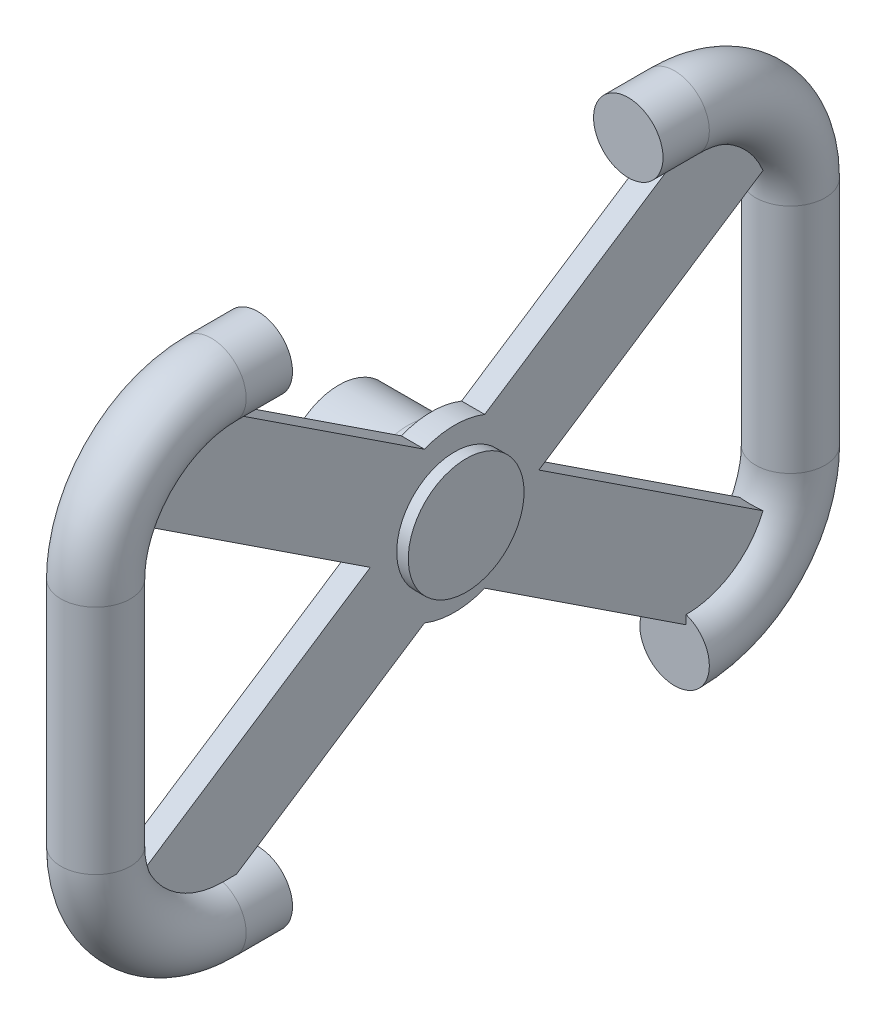
ISO-10303-21;
HEADER;
FILE_DESCRIPTION(('STEP AP214'),'2;1');
FILE_NAME('part.step','',(''),(''),'','','');
FILE_SCHEMA(('AUTOMOTIVE_DESIGN { 1 0 10303 214 1 1 1 1 }'));
ENDSEC;
DATA;
#1=APPLICATION_CONTEXT('core data for automotive mechanical design processes');
#2=APPLICATION_PROTOCOL_DEFINITION('international standard','automotive_design',2000,#1);
#3=PRODUCT_CONTEXT('',#1,'mechanical');
#4=PRODUCT('Part','Part','',(#3));
#5=PRODUCT_RELATED_PRODUCT_CATEGORY('part','',(#4));
#6=PRODUCT_DEFINITION_FORMATION('','',#4);
#7=PRODUCT_DEFINITION_CONTEXT('part definition',#1,'design');
#8=PRODUCT_DEFINITION('design','',#6,#7);
#9=PRODUCT_DEFINITION_SHAPE('','',#8);
#10=(LENGTH_UNIT() NAMED_UNIT(*) SI_UNIT(.MILLI.,.METRE.));
#11=(NAMED_UNIT(*) PLANE_ANGLE_UNIT() SI_UNIT($,.RADIAN.));
#12=(NAMED_UNIT(*) SI_UNIT($,.STERADIAN.) SOLID_ANGLE_UNIT());
#13=UNCERTAINTY_MEASURE_WITH_UNIT(LENGTH_MEASURE(1.E-05),#10,'distance_accuracy_value','');
#14=(GEOMETRIC_REPRESENTATION_CONTEXT(3) GLOBAL_UNCERTAINTY_ASSIGNED_CONTEXT((#13)) GLOBAL_UNIT_ASSIGNED_CONTEXT((#10,
#11,#12)) REPRESENTATION_CONTEXT('',''));
#15=CARTESIAN_POINT('',(0.,0.,0.));
#16=DIRECTION('',(0.,0.,1.));
#17=DIRECTION('',(1.,0.,0.));
#18=AXIS2_PLACEMENT_3D('',#15,#16,#17);
#19=CARTESIAN_POINT('',(-0.5,10.,0.));
#20=DIRECTION('',(1.,0.,0.));
#21=DIRECTION('',(0.,0.,-1.));
#22=AXIS2_PLACEMENT_3D('',#19,#20,#21);
#23=PLANE('',#22);
#24=DIRECTION('',(0.,0.549354169122413,0.835589610315867));
#25=VECTOR('',#24,1.);
#26=CARTESIAN_POINT('',(-0.5,19.892717906998,11.4065800408569));
#27=LINE('',#26,#25);
#28=CARTESIAN_POINT('',(-0.5,13.249078940462,1.30134009338308));
#29=VERTEX_POINT('',#28);
#30=CARTESIAN_POINT('',(-0.5,18.5857864376269,9.41868512973632));
#31=VERTEX_POINT('',#30);
#32=EDGE_CURVE('E302',#29,#31,#27,.T.);
#33=ORIENTED_EDGE('',*,*,#32,.F.);
#34=CARTESIAN_POINT('',(-0.5,10.,0.));
#35=DIRECTION('',(1.,0.,0.));
#36=DIRECTION('',(0.,0.,-1.));
#37=AXIS2_PLACEMENT_3D('',#34,#35,#36);
#38=CIRCLE('',#37,3.5);
#39=CARTESIAN_POINT('',(-0.5,6.75092105953799,1.30134009338307));
#40=VERTEX_POINT('',#39);
#41=EDGE_CURVE('E11',#29,#40,#38,.T.);
#42=ORIENTED_EDGE('',*,*,#41,.T.);
#43=DIRECTION('',(0.,0.549354169122413,-0.835589610315868));
#44=VECTOR('',#43,1.);
#45=CARTESIAN_POINT('',(-0.5,0.107282093002033,11.4065800408569));
#46=LINE('',#45,#44);
#47=CARTESIAN_POINT('',(-0.5,1.41421356237309,9.41868512973633));
#48=VERTEX_POINT('',#47);
#49=EDGE_CURVE('E324',#48,#40,#46,.T.);
#50=ORIENTED_EDGE('',*,*,#49,.F.);
#51=DIRECTION('',(0.,0.,-1.));
#52=VECTOR('',#51,1.);
#53=CARTESIAN_POINT('',(-0.5,1.41421356237309,10.));
#54=LINE('',#53,#52);
#55=CARTESIAN_POINT('',(-0.5,1.41421356237309,10.));
#56=VERTEX_POINT('',#55);
#57=EDGE_CURVE('E192',#56,#48,#54,.T.);
#58=ORIENTED_EDGE('',*,*,#57,.F.);
#59=CARTESIAN_POINT('',(-0.5,5.,10.));
#60=DIRECTION('',(-1.,0.,0.));
#61=DIRECTION('',(0.,0.,1.));
#62=AXIS2_PLACEMENT_3D('',#59,#60,#61);
#63=CIRCLE('',#62,3.58578643762691);
#64=CARTESIAN_POINT('',(-0.5,3.63823012137921,13.3171444306738));
#65=VERTEX_POINT('',#64);
#66=EDGE_CURVE('E191',#65,#56,#63,.F.);
#67=ORIENTED_EDGE('',*,*,#66,.F.);
#68=DIRECTION('',(0.,-0.549354169122413,0.835589610315867));
#69=VECTOR('',#68,1.);
#70=CARTESIAN_POINT('',(-0.5,3.4496405342655,13.6039967173465));
#71=LINE('',#70,#69);
#72=CARTESIAN_POINT('',(-0.5,10.,3.64063861241825));
#73=VERTEX_POINT('',#72);
#74=EDGE_CURVE('E314',#73,#65,#71,.T.);
#75=ORIENTED_EDGE('',*,*,#74,.F.);
#76=DIRECTION('',(0.,-0.549354169122414,-0.835589610315867));
#77=VECTOR('',#76,1.);
#78=CARTESIAN_POINT('',(-0.5,16.5503594657345,13.6039967173465));
#79=LINE('',#78,#77);
#80=CARTESIAN_POINT('',(-0.5,16.361769878618,13.3171444306695));
#81=VERTEX_POINT('',#80);
#82=EDGE_CURVE('E309',#81,#73,#79,.T.);
#83=ORIENTED_EDGE('',*,*,#82,.F.);
#84=CARTESIAN_POINT('',(-0.5,15.,10.));
#85=DIRECTION('',(-1.,0.,0.));
#86=DIRECTION('',(0.,0.,1.));
#87=AXIS2_PLACEMENT_3D('',#84,#85,#86);
#88=CIRCLE('',#87,3.58578643762691);
#89=CARTESIAN_POINT('',(-0.5,18.5857864376269,10.));
#90=VERTEX_POINT('',#89);
#91=EDGE_CURVE('E439',#90,#81,#88,.F.);
#92=ORIENTED_EDGE('',*,*,#91,.F.);
#93=DIRECTION('',(0.,0.,1.));
#94=VECTOR('',#93,1.);
#95=CARTESIAN_POINT('',(-0.5,18.5857864376269,-10.));
#96=LINE('',#95,#94);
#97=EDGE_CURVE('E304',#31,#90,#96,.T.);
#98=ORIENTED_EDGE('',*,*,#97,.F.);
#99=EDGE_LOOP('',(#33,#42,#50,#58,#67,#75,#83,#92,#98));
#100=FACE_BOUND('',#99,.T.);
#101=ADVANCED_FACE('F45',(#100),#23,.F.);
#102=DIRECTION('',(0.,-0.549354169122414,-0.835589610315867));
#103=VECTOR('',#102,1.);
#104=CARTESIAN_POINT('',(-0.5,6.75092105953799,-1.30134009338307));
#105=LINE('',#104,#103);
#106=CARTESIAN_POINT('',(-0.5,6.75092105953799,-1.30134009338307));
#107=VERTEX_POINT('',#106);
#108=CARTESIAN_POINT('',(-0.5,1.03203103687294,-10.));
#109=VERTEX_POINT('',#108);
#110=EDGE_CURVE('E330',#107,#109,#105,.T.);
#111=ORIENTED_EDGE('',*,*,#110,.F.);
#112=CARTESIAN_POINT('',(-0.5,10.,0.));
#113=DIRECTION('',(1.,0.,0.));
#114=DIRECTION('',(0.,0.,-1.));
#115=AXIS2_PLACEMENT_3D('',#112,#113,#114);
#116=CIRCLE('',#115,3.5);
#117=CARTESIAN_POINT('',(-0.5,13.249078940462,-1.30134009338307));
#118=VERTEX_POINT('',#117);
#119=EDGE_CURVE('E54',#107,#118,#116,.T.);
#120=ORIENTED_EDGE('',*,*,#119,.T.);
#121=DIRECTION('',(0.,-0.549354169122413,0.835589610315867));
#122=VECTOR('',#121,1.);
#123=CARTESIAN_POINT('',(-0.5,13.249078940462,-1.30134009338307));
#124=LINE('',#123,#122);
#125=CARTESIAN_POINT('',(-0.5,18.5857864376269,-9.41868512973631));
#126=VERTEX_POINT('',#125);
#127=EDGE_CURVE('E317',#126,#118,#124,.T.);
#128=ORIENTED_EDGE('',*,*,#127,.F.);
#129=DIRECTION('',(0.,0.,1.));
#130=VECTOR('',#129,1.);
#131=CARTESIAN_POINT('',(-0.5,18.5857864376269,-10.));
#132=LINE('',#131,#130);
#133=CARTESIAN_POINT('',(-0.5,18.5857864376269,-10.));
#134=VERTEX_POINT('',#133);
#135=EDGE_CURVE('E360',#126,#134,#132,.F.);
#136=ORIENTED_EDGE('',*,*,#135,.T.);
#137=CARTESIAN_POINT('',(-0.5,15.,-10.));
#138=DIRECTION('',(-1.,0.,0.));
#139=DIRECTION('',(0.,0.,1.));
#140=AXIS2_PLACEMENT_3D('',#137,#138,#139);
#141=CIRCLE('',#140,3.5857864376269);
#142=CARTESIAN_POINT('',(-0.499999999985733,16.361769878618,-13.3171444306695));
#143=VERTEX_POINT('',#142);
#144=EDGE_CURVE('E409',#134,#143,#141,.T.);
#145=ORIENTED_EDGE('',*,*,#144,.T.);
#146=DIRECTION('',(0.,0.549354169122413,-0.835589610315867));
#147=VECTOR('',#146,1.);
#148=CARTESIAN_POINT('',(-0.5,10.,-3.64063861241824));
#149=LINE('',#148,#147);
#150=CARTESIAN_POINT('',(-0.5,10.,-3.64063861241824));
#151=VERTEX_POINT('',#150);
#152=EDGE_CURVE('E458',#151,#143,#149,.T.);
#153=ORIENTED_EDGE('',*,*,#152,.F.);
#154=DIRECTION('',(0.,0.549354169122413,0.835589610315867));
#155=VECTOR('',#154,1.);
#156=CARTESIAN_POINT('',(-0.5,10.,-3.64063861241824));
#157=LINE('',#156,#155);
#158=CARTESIAN_POINT('',(-0.5,3.6382301213792,-13.3171444306738));
#159=VERTEX_POINT('',#158);
#160=EDGE_CURVE('E334',#159,#151,#157,.T.);
#161=ORIENTED_EDGE('',*,*,#160,.F.);
#162=CARTESIAN_POINT('',(-0.5,5.,-10.));
#163=DIRECTION('',(-1.,0.,0.));
#164=DIRECTION('',(0.,0.,1.));
#165=AXIS2_PLACEMENT_3D('',#162,#163,#164);
#166=CIRCLE('',#165,3.58578643762691);
#167=CARTESIAN_POINT('',(-0.5,1.41421356237309,-10.));
#168=VERTEX_POINT('',#167);
#169=EDGE_CURVE('E364',#159,#168,#166,.T.);
#170=ORIENTED_EDGE('',*,*,#169,.T.);
#171=DIRECTION('',(0.,1.,0.));
#172=VECTOR('',#171,1.);
#173=CARTESIAN_POINT('',(-0.5,0.,-10.));
#174=LINE('',#173,#172);
#175=EDGE_CURVE('E368',#109,#168,#174,.T.);
#176=ORIENTED_EDGE('',*,*,#175,.F.);
#177=EDGE_LOOP('',(#111,#120,#128,#136,#145,#153,#161,#170,#176));
#178=FACE_BOUND('',#177,.T.);
#179=ADVANCED_FACE('F245',(#178),#23,.F.);
#180=CARTESIAN_POINT('',(0.5,10.,0.));
#181=DIRECTION('',(1.,0.,0.));
#182=DIRECTION('',(0.,0.,-1.));
#183=AXIS2_PLACEMENT_3D('',#180,#181,#182);
#184=PLANE('',#183);
#185=CARTESIAN_POINT('',(0.5,10.,0.));
#186=DIRECTION('',(1.,0.,0.));
#187=DIRECTION('',(0.,0.,-1.));
#188=AXIS2_PLACEMENT_3D('',#185,#186,#187);
#189=CIRCLE('',#188,2.5);
#190=CARTESIAN_POINT('',(0.5,10.,-2.5));
#191=VERTEX_POINT('',#190);
#192=EDGE_CURVE('E863',#191,#191,#189,.T.);
#193=ORIENTED_EDGE('',*,*,#192,.F.);
#194=EDGE_LOOP('',(#193));
#195=FACE_BOUND('',#194,.T.);
#196=DIRECTION('',(0.,0.,1.));
#197=VECTOR('',#196,1.);
#198=CARTESIAN_POINT('',(0.5,18.5857864376269,-10.));
#199=LINE('',#198,#197);
#200=CARTESIAN_POINT('',(0.5,18.5857864376269,9.41868512973632));
#201=VERTEX_POINT('',#200);
#202=CARTESIAN_POINT('',(0.5,18.5857864376269,10.));
#203=VERTEX_POINT('',#202);
#204=EDGE_CURVE('E61',#201,#203,#199,.T.);
#205=ORIENTED_EDGE('',*,*,#204,.T.);
#206=CARTESIAN_POINT('',(0.5,15.,10.));
#207=DIRECTION('',(-1.,0.,0.));
#208=DIRECTION('',(0.,0.,1.));
#209=AXIS2_PLACEMENT_3D('',#206,#207,#208);
#210=CIRCLE('',#209,3.58578643762691);
#211=CARTESIAN_POINT('',(0.5,16.3617698786208,13.3171444306738));
#212=VERTEX_POINT('',#211);
#213=EDGE_CURVE('E446',#203,#212,#210,.F.);
#214=ORIENTED_EDGE('',*,*,#213,.T.);
#215=DIRECTION('',(0.,-0.549354169122414,-0.835589610315867));
#216=VECTOR('',#215,1.);
#217=CARTESIAN_POINT('',(0.5,16.5503594657345,13.6039967173465));
#218=LINE('',#217,#216);
#219=CARTESIAN_POINT('',(0.5,10.,3.64063861241825));
#220=VERTEX_POINT('',#219);
#221=EDGE_CURVE('E433',#212,#220,#218,.T.);
#222=ORIENTED_EDGE('',*,*,#221,.T.);
#223=DIRECTION('',(0.,-0.549354169122413,0.835589610315867));
#224=VECTOR('',#223,1.);
#225=CARTESIAN_POINT('',(0.5,3.4496405342655,13.6039967173465));
#226=LINE('',#225,#224);
#227=CARTESIAN_POINT('',(0.5,3.63823012138203,13.3171444306695));
#228=VERTEX_POINT('',#227);
#229=EDGE_CURVE('E183',#220,#228,#226,.T.);
#230=ORIENTED_EDGE('',*,*,#229,.T.);
#231=CARTESIAN_POINT('',(0.5,5.,10.));
#232=DIRECTION('',(-1.,0.,0.));
#233=DIRECTION('',(0.,0.,1.));
#234=AXIS2_PLACEMENT_3D('',#231,#232,#233);
#235=CIRCLE('',#234,3.58578643762691);
#236=CARTESIAN_POINT('',(0.5,1.41421356237309,10.));
#237=VERTEX_POINT('',#236);
#238=EDGE_CURVE('E68',#228,#237,#235,.F.);
#239=ORIENTED_EDGE('',*,*,#238,.T.);
#240=DIRECTION('',(0.,0.,-1.));
#241=VECTOR('',#240,1.);
#242=CARTESIAN_POINT('',(0.5,1.41421356237309,10.));
#243=LINE('',#242,#241);
#244=CARTESIAN_POINT('',(0.5,1.41421356237309,9.41868512973633));
#245=VERTEX_POINT('',#244);
#246=EDGE_CURVE('E185',#237,#245,#243,.T.);
#247=ORIENTED_EDGE('',*,*,#246,.T.);
#248=DIRECTION('',(0.,0.549354169122413,-0.835589610315868));
#249=VECTOR('',#248,1.);
#250=CARTESIAN_POINT('',(0.5,0.107282093002033,11.4065800408569));
#251=LINE('',#250,#249);
#252=CARTESIAN_POINT('',(0.5,6.75092105953799,1.30134009338307));
#253=VERTEX_POINT('',#252);
#254=EDGE_CURVE('E172',#245,#253,#251,.T.);
#255=ORIENTED_EDGE('',*,*,#254,.T.);
#256=CARTESIAN_POINT('',(0.5,10.,0.));
#257=DIRECTION('',(1.,0.,0.));
#258=DIRECTION('',(0.,0.,-1.));
#259=AXIS2_PLACEMENT_3D('',#256,#257,#258);
#260=CIRCLE('',#259,3.5);
#261=CARTESIAN_POINT('',(0.5,6.75092105953799,-1.30134009338307));
#262=VERTEX_POINT('',#261);
#263=EDGE_CURVE('E182',#253,#262,#260,.T.);
#264=ORIENTED_EDGE('',*,*,#263,.T.);
#265=DIRECTION('',(0.,-0.549354169122414,-0.835589610315867));
#266=VECTOR('',#265,1.);
#267=CARTESIAN_POINT('',(0.5,6.75092105953799,-1.30134009338307));
#268=LINE('',#267,#266);
#269=CARTESIAN_POINT('',(0.5,1.03203103687294,-10.));
#270=VERTEX_POINT('',#269);
#271=EDGE_CURVE('E477',#262,#270,#268,.T.);
#272=ORIENTED_EDGE('',*,*,#271,.T.);
#273=DIRECTION('',(0.,1.,0.));
#274=VECTOR('',#273,1.);
#275=CARTESIAN_POINT('',(0.5,0.,-10.));
#276=LINE('',#275,#274);
#277=CARTESIAN_POINT('',(0.5,1.41421356237309,-10.));
#278=VERTEX_POINT('',#277);
#279=EDGE_CURVE('E377',#270,#278,#276,.T.);
#280=ORIENTED_EDGE('',*,*,#279,.T.);
#281=CARTESIAN_POINT('',(0.5,5.,-10.));
#282=DIRECTION('',(-1.,0.,0.));
#283=DIRECTION('',(0.,0.,1.));
#284=AXIS2_PLACEMENT_3D('',#281,#282,#283);
#285=CIRCLE('',#284,3.58578643762691);
#286=CARTESIAN_POINT('',(0.499999999985731,3.63823012138203,-13.3171444306695));
#287=VERTEX_POINT('',#286);
#288=EDGE_CURVE('E374',#287,#278,#285,.T.);
#289=ORIENTED_EDGE('',*,*,#288,.F.);
#290=DIRECTION('',(0.,0.549354169122413,0.835589610315867));
#291=VECTOR('',#290,1.);
#292=CARTESIAN_POINT('',(0.5,10.,-3.64063861241824));
#293=LINE('',#292,#291);
#294=CARTESIAN_POINT('',(0.5,10.,-3.64063861241824));
#295=VERTEX_POINT('',#294);
#296=EDGE_CURVE('E343',#287,#295,#293,.T.);
#297=ORIENTED_EDGE('',*,*,#296,.T.);
#298=DIRECTION('',(0.,0.549354169122413,-0.835589610315867));
#299=VECTOR('',#298,1.);
#300=CARTESIAN_POINT('',(0.5,10.,-3.64063861241824));
#301=LINE('',#300,#299);
#302=CARTESIAN_POINT('',(0.5,16.3617698786208,-13.3171444306738));
#303=VERTEX_POINT('',#302);
#304=EDGE_CURVE('E337',#295,#303,#301,.T.);
#305=ORIENTED_EDGE('',*,*,#304,.T.);
#306=CARTESIAN_POINT('',(0.5,15.,-10.));
#307=DIRECTION('',(-1.,0.,0.));
#308=DIRECTION('',(0.,0.,1.));
#309=AXIS2_PLACEMENT_3D('',#306,#307,#308);
#310=CIRCLE('',#309,3.5857864376269);
#311=CARTESIAN_POINT('',(0.5,18.5857864376269,-10.));
#312=VERTEX_POINT('',#311);
#313=EDGE_CURVE('E269',#312,#303,#310,.T.);
#314=ORIENTED_EDGE('',*,*,#313,.F.);
#315=DIRECTION('',(0.,0.,1.));
#316=VECTOR('',#315,1.);
#317=CARTESIAN_POINT('',(0.5,18.5857864376269,-10.));
#318=LINE('',#317,#316);
#319=CARTESIAN_POINT('',(0.5,18.5857864376269,-9.41868512973631));
#320=VERTEX_POINT('',#319);
#321=EDGE_CURVE('E371',#320,#312,#318,.F.);
#322=ORIENTED_EDGE('',*,*,#321,.F.);
#323=DIRECTION('',(0.,-0.549354169122413,0.835589610315867));
#324=VECTOR('',#323,1.);
#325=CARTESIAN_POINT('',(0.5,13.249078940462,-1.30134009338307));
#326=LINE('',#325,#324);
#327=CARTESIAN_POINT('',(0.5,13.249078940462,-1.30134009338307));
#328=VERTEX_POINT('',#327);
#329=EDGE_CURVE('E462',#320,#328,#326,.T.);
#330=ORIENTED_EDGE('',*,*,#329,.T.);
#331=CARTESIAN_POINT('',(0.5,10.,0.));
#332=DIRECTION('',(1.,0.,0.));
#333=DIRECTION('',(0.,0.,-1.));
#334=AXIS2_PLACEMENT_3D('',#331,#332,#333);
#335=CIRCLE('',#334,3.5);
#336=CARTESIAN_POINT('',(0.5,13.249078940462,1.30134009338308));
#337=VERTEX_POINT('',#336);
#338=EDGE_CURVE('E465',#328,#337,#335,.T.);
#339=ORIENTED_EDGE('',*,*,#338,.T.);
#340=DIRECTION('',(0.,0.549354169122413,0.835589610315867));
#341=VECTOR('',#340,1.);
#342=CARTESIAN_POINT('',(0.5,19.892717906998,11.4065800408569));
#343=LINE('',#342,#341);
#344=EDGE_CURVE('E468',#337,#201,#343,.T.);
#345=ORIENTED_EDGE('',*,*,#344,.T.);
#346=EDGE_LOOP('',(#205,#214,#222,#230,#239,#247,#255,#264,#272,#280,#289,#297,#305,#314,#322,
#330,#339,#345));
#347=FACE_BOUND('',#346,.T.);
#348=ADVANCED_FACE('F186',(#195,#347),#184,.T.);
#349=CARTESIAN_POINT('',(0.5,16.5503594657345,13.6039967173465));
#350=DIRECTION('',(0.,0.835589610315867,-0.549354169122414));
#351=DIRECTION('',(0.,0.549354169122413,0.835589610315867));
#352=AXIS2_PLACEMENT_3D('',#349,#350,#351);
#353=PLANE('',#352);
#354=CARTESIAN_POINT('',(-0.5002,16.3618094602204,13.3172046358661));
#355=CARTESIAN_POINT('',(-0.46062840166001,16.3539753619892,13.3052886598781));
#356=CARTESIAN_POINT('',(-0.420464867963762,16.3470702838459,13.2947857605114));
#357=CARTESIAN_POINT('',(-0.339216753740204,16.3351634346082,13.2766749677408));
#358=CARTESIAN_POINT('',(-0.29813223739703,16.3301615313137,13.2690668732553));
#359=CARTESIAN_POINT('',(-0.176301508235127,16.318312255501,13.2510436519613));
#360=CARTESIAN_POINT('',(-0.0946359975060376,16.3141619674951,13.244730898309));
#361=CARTESIAN_POINT('',(0.0730011541401362,16.3133558812556,13.243504808976));
#362=CARTESIAN_POINT('',(0.158980168279458,16.317092757021,13.2491887461155));
#363=CARTESIAN_POINT('',(0.287299274936944,16.3289180957067,13.2671755580843));
#364=CARTESIAN_POINT('',(0.330613755528792,16.3340238477235,13.27494161062));
#365=CARTESIAN_POINT('',(0.416236541731515,16.3463463816786,13.2936846764314));
#366=CARTESIAN_POINT('',(0.458544841119745,16.3535631766688,13.3046617095596));
#367=CARTESIAN_POINT('',(0.5002,16.3618094602204,13.3172046358661));
#368=B_SPLINE_CURVE_WITH_KNOTS('',3,(#354,#355,#356,#357,#358,#359,#360,#361,#362,#363,#364,
#365,#366,#367),.UNSPECIFIED.,.F.,.F.,(4,2,2,2,2,2,4),(0.,0.126117072612424,0.252225383166895,
0.497077912505269,0.754407410119694,0.887152066947782,1.01989754451097),.UNSPECIFIED.);
#369=EDGE_CURVE('E204',#81,#212,#368,.T.);
#370=ORIENTED_EDGE('',*,*,#369,.F.);
#371=ORIENTED_EDGE('',*,*,#82,.T.);
#372=DIRECTION('',(-1.,0.,0.));
#373=VECTOR('',#372,1.);
#374=CARTESIAN_POINT('',(0.5,10.,3.64063861241825));
#375=LINE('',#374,#373);
#376=EDGE_CURVE('E349',#220,#73,#375,.T.);
#377=ORIENTED_EDGE('',*,*,#376,.F.);
#378=ORIENTED_EDGE('',*,*,#221,.F.);
#379=EDGE_LOOP('',(#370,#371,#377,#378));
#380=FACE_BOUND('',#379,.T.);
#381=ADVANCED_FACE('F244',(#380),#353,.F.);
#382=CARTESIAN_POINT('',(0.5,3.4496405342655,13.6039967173465));
#383=DIRECTION('',(0.,-0.835589610315867,-0.549354169122413));
#384=DIRECTION('',(0.,0.549354169122413,-0.835589610315867));
#385=AXIS2_PLACEMENT_3D('',#382,#383,#384);
#386=PLANE('',#385);
#387=CARTESIAN_POINT('',(0.5002,3.6381905397796,13.3172046358661));
#388=CARTESIAN_POINT('',(0.460628401660009,3.64602463801076,13.3052886598781));
#389=CARTESIAN_POINT('',(0.420464867963761,3.65292971615407,13.2947857605114));
#390=CARTESIAN_POINT('',(0.339216753740204,3.66483656539182,13.2766749677408));
#391=CARTESIAN_POINT('',(0.29813223739703,3.66983846868631,13.2690668732553));
#392=CARTESIAN_POINT('',(0.176301508235127,3.681687744499,13.2510436519613));
#393=CARTESIAN_POINT('',(0.0946359975060375,3.68583803250493,13.244730898309));
#394=CARTESIAN_POINT('',(-0.0730011541401364,3.68664411874445,13.243504808976));
#395=CARTESIAN_POINT('',(-0.158980168279458,3.68290724297906,13.2491887461155));
#396=CARTESIAN_POINT('',(-0.287299274936944,3.67108190429333,13.2671755580843));
#397=CARTESIAN_POINT('',(-0.330613755528792,3.66597615227651,13.27494161062));
#398=CARTESIAN_POINT('',(-0.416236541731515,3.6536536183214,13.2936846764314));
#399=CARTESIAN_POINT('',(-0.458544841119745,3.64643682333122,13.3046617095596));
#400=CARTESIAN_POINT('',(-0.5002,3.6381905397796,13.3172046358661));
#401=B_SPLINE_CURVE_WITH_KNOTS('',3,(#387,#388,#389,#390,#391,#392,#393,#394,#395,#396,#397,
#398,#399,#400),.UNSPECIFIED.,.F.,.F.,(4,2,2,2,2,2,4),(0.,0.126117072612424,0.252225383166895,
0.497077912505269,0.754407410119694,0.887152066947782,1.01989754451097),.UNSPECIFIED.);
#402=EDGE_CURVE('E198',#228,#65,#401,.T.);
#403=ORIENTED_EDGE('',*,*,#402,.F.);
#404=ORIENTED_EDGE('',*,*,#229,.F.);
#405=ORIENTED_EDGE('',*,*,#376,.T.);
#406=ORIENTED_EDGE('',*,*,#74,.T.);
#407=EDGE_LOOP('',(#403,#404,#405,#406));
#408=FACE_BOUND('',#407,.T.);
#409=ADVANCED_FACE('F224',(#408),#386,.F.);
#410=CARTESIAN_POINT('',(0.,20.,-10.));
#411=DIRECTION('',(0.,0.,1.));
#412=DIRECTION('',(1.,0.,0.));
#413=AXIS2_PLACEMENT_3D('',#410,#411,#412);
#414=CYLINDRICAL_SURFACE('',#413,1.5);
#415=CARTESIAN_POINT('',(0.,20.,-11.569760384839));
#416=DIRECTION('',(0.,-0.835589610315867,-0.549354169122413));
#417=DIRECTION('',(0.,-0.549354169122413,0.835589610315867));
#418=AXIS2_PLACEMENT_3D('',#415,#416,#417);
#419=ELLIPSE('',#418,2.73047895931368,1.5);
#420=EDGE_CURVE('E199',#320,#126,#419,.T.);
#421=ORIENTED_EDGE('',*,*,#420,.F.);
#422=ORIENTED_EDGE('',*,*,#321,.T.);
#423=CARTESIAN_POINT('',(0.,20.,-10.));
#424=DIRECTION('',(0.,0.,-1.));
#425=DIRECTION('',(1.,0.,0.));
#426=AXIS2_PLACEMENT_3D('',#423,#424,#425);
#427=CIRCLE('',#426,1.5);
#428=EDGE_CURVE('E382',#134,#312,#427,.T.);
#429=ORIENTED_EDGE('',*,*,#428,.F.);
#430=ORIENTED_EDGE('',*,*,#135,.F.);
#431=EDGE_LOOP('',(#421,#422,#429,#430));
#432=FACE_BOUND('',#431,.T.);
#433=CARTESIAN_POINT('',(0.,20.,-8.));
#434=DIRECTION('',(0.,0.,1.));
#435=DIRECTION('',(1.,0.,0.));
#436=AXIS2_PLACEMENT_3D('',#433,#434,#435);
#437=CIRCLE('',#436,1.5);
#438=CARTESIAN_POINT('',(1.5,20.,-8.));
#439=VERTEX_POINT('',#438);
#440=EDGE_CURVE('E386',#439,#439,#437,.T.);
#441=ORIENTED_EDGE('',*,*,#440,.F.);
#442=EDGE_LOOP('',(#441));
#443=FACE_BOUND('',#442,.T.);
#444=ADVANCED_FACE('F283',(#432,#443),#414,.T.);
#445=CARTESIAN_POINT('',(0.,0.,-10.));
#446=DIRECTION('',(0.,0.,1.));
#447=DIRECTION('',(1.,0.,0.));
#448=AXIS2_PLACEMENT_3D('',#445,#446,#447);
#449=PLANE('',#448);
#450=ORIENTED_EDGE('',*,*,#279,.F.);
#451=DIRECTION('',(-1.,0.,0.));
#452=VECTOR('',#451,1.);
#453=CARTESIAN_POINT('',(0.,1.03203103687294,-10.));
#454=LINE('',#453,#452);
#455=EDGE_CURVE('E207',#270,#109,#454,.T.);
#456=ORIENTED_EDGE('',*,*,#455,.T.);
#457=ORIENTED_EDGE('',*,*,#175,.T.);
#458=CARTESIAN_POINT('',(0.,0.,-10.));
#459=DIRECTION('',(0.,0.,1.));
#460=DIRECTION('',(1.,0.,0.));
#461=AXIS2_PLACEMENT_3D('',#458,#459,#460);
#462=CIRCLE('',#461,1.5);
#463=EDGE_CURVE('E381',#168,#278,#462,.T.);
#464=ORIENTED_EDGE('',*,*,#463,.T.);
#465=EDGE_LOOP('',(#450,#456,#457,#464));
#466=FACE_BOUND('',#465,.T.);
#467=ADVANCED_FACE('F277',(#466),#449,.T.);
#468=CARTESIAN_POINT('',(0.,5.,-10.));
#469=DIRECTION('',(1.,0.,0.));
#470=DIRECTION('',(0.,0.,-1.));
#471=AXIS2_PLACEMENT_3D('',#468,#469,#470);
#472=TOROIDAL_SURFACE('',#471,5.,1.5);
#473=CARTESIAN_POINT('',(0.5002,3.6381905397796,-13.3172046358661));
#474=CARTESIAN_POINT('',(0.460628401660009,3.64602463801076,-13.3052886598781));
#475=CARTESIAN_POINT('',(0.420464867963762,3.65292971615406,-13.2947857605114));
#476=CARTESIAN_POINT('',(0.339216753740204,3.66483656539181,-13.2766749677408));
#477=CARTESIAN_POINT('',(0.29813223739703,3.6698384686863,-13.2690668732553));
#478=CARTESIAN_POINT('',(0.176301508235127,3.681687744499,-13.2510436519613));
#479=CARTESIAN_POINT('',(0.0946359975060375,3.68583803250493,-13.244730898309));
#480=CARTESIAN_POINT('',(-0.0730011541401364,3.68664411874445,-13.243504808976));
#481=CARTESIAN_POINT('',(-0.158980168279458,3.68290724297905,-13.2491887461155));
#482=CARTESIAN_POINT('',(-0.287299274936944,3.67108190429332,-13.2671755580843));
#483=CARTESIAN_POINT('',(-0.330613755528792,3.6659761522765,-13.27494161062));
#484=CARTESIAN_POINT('',(-0.416236541731515,3.6536536183214,-13.2936846764314));
#485=CARTESIAN_POINT('',(-0.458544841119745,3.64643682333121,-13.3046617095596));
#486=CARTESIAN_POINT('',(-0.5002,3.6381905397796,-13.3172046358661));
#487=B_SPLINE_CURVE_WITH_KNOTS('',3,(#473,#474,#475,#476,#477,#478,#479,#480,#481,#482,#483,
#484,#485,#486),.UNSPECIFIED.,.F.,.F.,(4,2,2,2,2,2,4),(0.,0.126117072612424,0.252225383166895,
0.497077912505269,0.754407410119694,0.887152066947782,1.01989754451097),.UNSPECIFIED.);
#488=EDGE_CURVE('E260',#287,#159,#487,.T.);
#489=ORIENTED_EDGE('',*,*,#488,.F.);
#490=ORIENTED_EDGE('',*,*,#288,.T.);
#491=ORIENTED_EDGE('',*,*,#463,.F.);
#492=ORIENTED_EDGE('',*,*,#169,.F.);
#493=EDGE_LOOP('',(#489,#490,#491,#492));
#494=FACE_BOUND('',#493,.T.);
#495=CARTESIAN_POINT('',(0.,5.,-15.));
#496=DIRECTION('',(0.,-1.,0.));
#497=DIRECTION('',(1.,0.,0.));
#498=AXIS2_PLACEMENT_3D('',#495,#496,#497);
#499=CIRCLE('',#498,1.5);
#500=CARTESIAN_POINT('',(1.5,5.,-15.));
#501=VERTEX_POINT('',#500);
#502=EDGE_CURVE('E391',#501,#501,#499,.T.);
#503=ORIENTED_EDGE('',*,*,#502,.T.);
#504=EDGE_LOOP('',(#503));
#505=FACE_BOUND('',#504,.T.);
#506=ADVANCED_FACE('F271',(#494,#505),#472,.T.);
#507=CARTESIAN_POINT('',(0.,5.,-15.));
#508=DIRECTION('',(0.,1.,0.));
#509=DIRECTION('',(0.,0.,1.));
#510=AXIS2_PLACEMENT_3D('',#507,#508,#509);
#511=CYLINDRICAL_SURFACE('',#510,1.5);
#512=CARTESIAN_POINT('',(0.,15.,-15.));
#513=DIRECTION('',(0.,-1.,0.));
#514=DIRECTION('',(1.,0.,0.));
#515=AXIS2_PLACEMENT_3D('',#512,#513,#514);
#516=CIRCLE('',#515,1.5);
#517=CARTESIAN_POINT('',(1.5,15.,-15.));
#518=VERTEX_POINT('',#517);
#519=EDGE_CURVE('E387',#518,#518,#516,.T.);
#520=ORIENTED_EDGE('',*,*,#519,.T.);
#521=EDGE_LOOP('',(#520));
#522=FACE_BOUND('',#521,.T.);
#523=ORIENTED_EDGE('',*,*,#502,.F.);
#524=EDGE_LOOP('',(#523));
#525=FACE_BOUND('',#524,.T.);
#526=ADVANCED_FACE('F276',(#522,#525),#511,.T.);
#527=CARTESIAN_POINT('',(0.,15.,-10.));
#528=DIRECTION('',(1.,0.,0.));
#529=DIRECTION('',(0.,0.,-1.));
#530=AXIS2_PLACEMENT_3D('',#527,#528,#529);
#531=TOROIDAL_SURFACE('',#530,5.,1.5);
#532=ORIENTED_EDGE('',*,*,#428,.T.);
#533=ORIENTED_EDGE('',*,*,#313,.T.);
#534=CARTESIAN_POINT('',(-0.5002,16.3618094602204,-13.3172046358661));
#535=CARTESIAN_POINT('',(-0.46062840166001,16.3539753619892,-13.3052886598781));
#536=CARTESIAN_POINT('',(-0.420464867963762,16.3470702838459,-13.2947857605114));
#537=CARTESIAN_POINT('',(-0.339216753740204,16.3351634346082,-13.2766749677408));
#538=CARTESIAN_POINT('',(-0.29813223739703,16.3301615313137,-13.2690668732553));
#539=CARTESIAN_POINT('',(-0.176301508235127,16.318312255501,-13.2510436519613));
#540=CARTESIAN_POINT('',(-0.0946359975060376,16.3141619674951,-13.244730898309));
#541=CARTESIAN_POINT('',(0.0730011541401362,16.3133558812556,-13.243504808976));
#542=CARTESIAN_POINT('',(0.158980168279457,16.317092757021,-13.2491887461155));
#543=CARTESIAN_POINT('',(0.287299274936944,16.3289180957067,-13.2671755580843));
#544=CARTESIAN_POINT('',(0.330613755528792,16.3340238477235,-13.27494161062));
#545=CARTESIAN_POINT('',(0.416236541731515,16.3463463816786,-13.2936846764314));
#546=CARTESIAN_POINT('',(0.458544841119745,16.3535631766688,-13.3046617095596));
#547=CARTESIAN_POINT('',(0.5002,16.3618094602204,-13.3172046358661));
#548=B_SPLINE_CURVE_WITH_KNOTS('',3,(#534,#535,#536,#537,#538,#539,#540,#541,#542,#543,#544,
#545,#546,#547),.UNSPECIFIED.,.F.,.F.,(4,2,2,2,2,2,4),(0.,0.126117072612424,0.252225383166895,
0.49707791250527,0.754407410119695,0.887152066947783,1.01989754451097),.UNSPECIFIED.);
#549=EDGE_CURVE('E401',#143,#303,#548,.T.);
#550=ORIENTED_EDGE('',*,*,#549,.F.);
#551=ORIENTED_EDGE('',*,*,#144,.F.);
#552=EDGE_LOOP('',(#532,#533,#550,#551));
#553=FACE_BOUND('',#552,.T.);
#554=ORIENTED_EDGE('',*,*,#519,.F.);
#555=EDGE_LOOP('',(#554));
#556=FACE_BOUND('',#555,.T.);
#557=ADVANCED_FACE('F281',(#553,#556),#531,.T.);
#558=CARTESIAN_POINT('',(0.,20.,-8.));
#559=DIRECTION('',(0.,0.,1.));
#560=DIRECTION('',(1.,0.,0.));
#561=AXIS2_PLACEMENT_3D('',#558,#559,#560);
#562=PLANE('',#561);
#563=ORIENTED_EDGE('',*,*,#440,.T.);
#564=EDGE_LOOP('',(#563));
#565=FACE_BOUND('',#564,.T.);
#566=ADVANCED_FACE('F255',(#565),#562,.T.);
#567=CARTESIAN_POINT('',(0.5,10.,-3.64063861241824));
#568=DIRECTION('',(0.,-0.835589610315867,0.549354169122413));
#569=DIRECTION('',(0.,-0.549354169122413,-0.835589610315867));
#570=AXIS2_PLACEMENT_3D('',#567,#568,#569);
#571=PLANE('',#570);
#572=ORIENTED_EDGE('',*,*,#296,.F.);
#573=ORIENTED_EDGE('',*,*,#488,.T.);
#574=ORIENTED_EDGE('',*,*,#160,.T.);
#575=DIRECTION('',(-1.,0.,0.));
#576=VECTOR('',#575,1.);
#577=CARTESIAN_POINT('',(0.5,10.,-3.64063861241824));
#578=LINE('',#577,#576);
#579=EDGE_CURVE('E338',#295,#151,#578,.T.);
#580=ORIENTED_EDGE('',*,*,#579,.F.);
#581=EDGE_LOOP('',(#572,#573,#574,#580));
#582=FACE_BOUND('',#581,.T.);
#583=ADVANCED_FACE('F250',(#582),#571,.F.);
#584=CARTESIAN_POINT('',(0.5,10.,-3.64063861241824));
#585=DIRECTION('',(0.,0.835589610315868,0.549354169122413));
#586=DIRECTION('',(0.,-0.549354169122413,0.835589610315867));
#587=AXIS2_PLACEMENT_3D('',#584,#585,#586);
#588=PLANE('',#587);
#589=ORIENTED_EDGE('',*,*,#152,.T.);
#590=ORIENTED_EDGE('',*,*,#549,.T.);
#591=ORIENTED_EDGE('',*,*,#304,.F.);
#592=ORIENTED_EDGE('',*,*,#579,.T.);
#593=EDGE_LOOP('',(#589,#590,#591,#592));
#594=FACE_BOUND('',#593,.T.);
#595=ADVANCED_FACE('F254',(#594),#588,.F.);
#596=CARTESIAN_POINT('',(0.5,13.249078940462,-1.30134009338307));
#597=DIRECTION('',(0.,-0.835589610315867,-0.549354169122413));
#598=DIRECTION('',(0.,0.549354169122413,-0.835589610315867));
#599=AXIS2_PLACEMENT_3D('',#596,#597,#598);
#600=PLANE('',#599);
#601=ORIENTED_EDGE('',*,*,#329,.F.);
#602=ORIENTED_EDGE('',*,*,#420,.T.);
#603=ORIENTED_EDGE('',*,*,#127,.T.);
#604=DIRECTION('',(-1.,0.,0.));
#605=VECTOR('',#604,1.);
#606=CARTESIAN_POINT('',(0.5,13.249078940462,-1.30134009338307));
#607=LINE('',#606,#605);
#608=EDGE_CURVE('E356',#328,#118,#607,.T.);
#609=ORIENTED_EDGE('',*,*,#608,.F.);
#610=EDGE_LOOP('',(#601,#602,#603,#609));
#611=FACE_BOUND('',#610,.T.);
#612=ADVANCED_FACE('F414',(#611),#600,.F.);
#613=CARTESIAN_POINT('',(0.5,10.,0.));
#614=DIRECTION('',(-1.,0.,0.));
#615=DIRECTION('',(0.,0.,1.));
#616=AXIS2_PLACEMENT_3D('',#613,#614,#615);
#617=CYLINDRICAL_SURFACE('',#616,3.5);
#618=CARTESIAN_POINT('',(-0.5,10.,0.));
#619=DIRECTION('',(1.,0.,0.));
#620=DIRECTION('',(0.,0.,-1.));
#621=AXIS2_PLACEMENT_3D('',#618,#619,#620);
#622=CIRCLE('',#621,3.5);
#623=EDGE_CURVE('E310',#118,#29,#622,.T.);
#624=ORIENTED_EDGE('',*,*,#623,.T.);
#625=DIRECTION('',(-1.,0.,0.));
#626=VECTOR('',#625,1.);
#627=CARTESIAN_POINT('',(0.5,13.249078940462,1.30134009338308));
#628=LINE('',#627,#626);
#629=EDGE_CURVE('E353',#337,#29,#628,.T.);
#630=ORIENTED_EDGE('',*,*,#629,.F.);
#631=ORIENTED_EDGE('',*,*,#338,.F.);
#632=ORIENTED_EDGE('',*,*,#608,.T.);
#633=EDGE_LOOP('',(#624,#630,#631,#632));
#634=FACE_BOUND('',#633,.T.);
#635=ADVANCED_FACE('F418',(#634),#617,.T.);
#636=CARTESIAN_POINT('',(0.5,19.892717906998,11.4065800408569));
#637=DIRECTION('',(0.,-0.835589610315867,0.549354169122413));
#638=DIRECTION('',(0.,-0.549354169122413,-0.835589610315867));
#639=AXIS2_PLACEMENT_3D('',#636,#637,#638);
#640=PLANE('',#639);
#641=CARTESIAN_POINT('',(0.,20.,11.5697603848391));
#642=DIRECTION('',(0.,-0.835589610315867,0.549354169122413));
#643=DIRECTION('',(0.,0.549354169122413,0.835589610315867));
#644=AXIS2_PLACEMENT_3D('',#641,#642,#643);
#645=ELLIPSE('',#644,2.73047895931368,1.5);
#646=EDGE_CURVE('E437',#201,#31,#645,.F.);
#647=ORIENTED_EDGE('',*,*,#646,.F.);
#648=ORIENTED_EDGE('',*,*,#344,.F.);
#649=ORIENTED_EDGE('',*,*,#629,.T.);
#650=ORIENTED_EDGE('',*,*,#32,.T.);
#651=EDGE_LOOP('',(#647,#648,#649,#650));
#652=FACE_BOUND('',#651,.T.);
#653=ADVANCED_FACE('F422',(#652),#640,.F.);
#654=CARTESIAN_POINT('',(0.5,0.107282093002033,11.4065800408569));
#655=DIRECTION('',(0.,0.835589610315868,0.549354169122413));
#656=DIRECTION('',(0.,-0.549354169122413,0.835589610315868));
#657=AXIS2_PLACEMENT_3D('',#654,#655,#656);
#658=PLANE('',#657);
#659=CARTESIAN_POINT('',(0.,0.,11.5697603848391));
#660=DIRECTION('',(0.,0.835589610315868,0.549354169122413));
#661=DIRECTION('',(0.,0.549354169122413,-0.835589610315868));
#662=AXIS2_PLACEMENT_3D('',#659,#660,#661);
#663=ELLIPSE('',#662,2.73047895931368,1.5);
#664=EDGE_CURVE('E176',#48,#245,#663,.F.);
#665=ORIENTED_EDGE('',*,*,#664,.F.);
#666=ORIENTED_EDGE('',*,*,#49,.T.);
#667=DIRECTION('',(-1.,0.,0.));
#668=VECTOR('',#667,1.);
#669=CARTESIAN_POINT('',(0.5,6.75092105953799,1.30134009338307));
#670=LINE('',#669,#668);
#671=EDGE_CURVE('E179',#253,#40,#670,.T.);
#672=ORIENTED_EDGE('',*,*,#671,.F.);
#673=ORIENTED_EDGE('',*,*,#254,.F.);
#674=EDGE_LOOP('',(#665,#666,#672,#673));
#675=FACE_BOUND('',#674,.T.);
#676=ADVANCED_FACE('F173',(#675),#658,.F.);
#677=CARTESIAN_POINT('',(0.5,10.,0.));
#678=DIRECTION('',(-1.,0.,0.));
#679=DIRECTION('',(0.,0.,1.));
#680=AXIS2_PLACEMENT_3D('',#677,#678,#679);
#681=CYLINDRICAL_SURFACE('',#680,3.5);
#682=CARTESIAN_POINT('',(-0.5,10.,0.));
#683=DIRECTION('',(1.,0.,0.));
#684=DIRECTION('',(0.,0.,-1.));
#685=AXIS2_PLACEMENT_3D('',#682,#683,#684);
#686=CIRCLE('',#685,3.5);
#687=EDGE_CURVE('E327',#40,#107,#686,.T.);
#688=ORIENTED_EDGE('',*,*,#687,.T.);
#689=DIRECTION('',(-1.,0.,0.));
#690=VECTOR('',#689,1.);
#691=CARTESIAN_POINT('',(0.5,6.75092105953799,-1.30134009338307));
#692=LINE('',#691,#690);
#693=EDGE_CURVE('E342',#262,#107,#692,.T.);
#694=ORIENTED_EDGE('',*,*,#693,.F.);
#695=ORIENTED_EDGE('',*,*,#263,.F.);
#696=ORIENTED_EDGE('',*,*,#671,.T.);
#697=EDGE_LOOP('',(#688,#694,#695,#696));
#698=FACE_BOUND('',#697,.T.);
#699=ADVANCED_FACE('F499',(#698),#681,.T.);
#700=CARTESIAN_POINT('',(0.5,6.75092105953799,-1.30134009338307));
#701=DIRECTION('',(0.,0.835589610315867,-0.549354169122414));
#702=DIRECTION('',(0.,0.549354169122413,0.835589610315867));
#703=AXIS2_PLACEMENT_3D('',#700,#701,#702);
#704=PLANE('',#703);
#705=ORIENTED_EDGE('',*,*,#455,.F.);
#706=ORIENTED_EDGE('',*,*,#271,.F.);
#707=ORIENTED_EDGE('',*,*,#693,.T.);
#708=ORIENTED_EDGE('',*,*,#110,.T.);
#709=EDGE_LOOP('',(#705,#706,#707,#708));
#710=FACE_BOUND('',#709,.T.);
#711=ADVANCED_FACE('F257',(#710),#704,.F.);
#712=CARTESIAN_POINT('',(0.,15.,10.));
#713=DIRECTION('',(1.,0.,0.));
#714=DIRECTION('',(0.,0.,-1.));
#715=AXIS2_PLACEMENT_3D('',#712,#713,#714);
#716=TOROIDAL_SURFACE('',#715,5.,1.5);
#717=ORIENTED_EDGE('',*,*,#213,.F.);
#718=CARTESIAN_POINT('',(0.,20.,10.));
#719=DIRECTION('',(0.,0.,-1.));
#720=DIRECTION('',(1.,0.,0.));
#721=AXIS2_PLACEMENT_3D('',#718,#719,#720);
#722=CIRCLE('',#721,1.5);
#723=EDGE_CURVE('E444',#90,#203,#722,.T.);
#724=ORIENTED_EDGE('',*,*,#723,.F.);
#725=ORIENTED_EDGE('',*,*,#91,.T.);
#726=ORIENTED_EDGE('',*,*,#369,.T.);
#727=EDGE_LOOP('',(#717,#724,#725,#726));
#728=FACE_BOUND('',#727,.T.);
#729=CARTESIAN_POINT('',(0.,15.,15.));
#730=DIRECTION('',(0.,1.,0.));
#731=DIRECTION('',(1.,0.,0.));
#732=AXIS2_PLACEMENT_3D('',#729,#730,#731);
#733=CIRCLE('',#732,1.5);
#734=CARTESIAN_POINT('',(1.5,15.,15.));
#735=VERTEX_POINT('',#734);
#736=EDGE_CURVE('E872',#735,#735,#733,.T.);
#737=ORIENTED_EDGE('',*,*,#736,.T.);
#738=EDGE_LOOP('',(#737));
#739=FACE_BOUND('',#738,.T.);
#740=ADVANCED_FACE('F441',(#728,#739),#716,.T.);
#741=CARTESIAN_POINT('',(0.,20.,-10.));
#742=DIRECTION('',(0.,0.,1.));
#743=DIRECTION('',(1.,0.,0.));
#744=AXIS2_PLACEMENT_3D('',#741,#742,#743);
#745=CYLINDRICAL_SURFACE('',#744,1.5);
#746=ORIENTED_EDGE('',*,*,#204,.F.);
#747=ORIENTED_EDGE('',*,*,#646,.T.);
#748=ORIENTED_EDGE('',*,*,#97,.T.);
#749=ORIENTED_EDGE('',*,*,#723,.T.);
#750=EDGE_LOOP('',(#746,#747,#748,#749));
#751=FACE_BOUND('',#750,.T.);
#752=CARTESIAN_POINT('',(0.,20.,8.));
#753=DIRECTION('',(0.,0.,1.));
#754=DIRECTION('',(1.,0.,0.));
#755=AXIS2_PLACEMENT_3D('',#752,#753,#754);
#756=CIRCLE('',#755,1.5);
#757=CARTESIAN_POINT('',(1.5,20.,8.));
#758=VERTEX_POINT('',#757);
#759=EDGE_CURVE('E854',#758,#758,#756,.T.);
#760=ORIENTED_EDGE('',*,*,#759,.T.);
#761=EDGE_LOOP('',(#760));
#762=FACE_BOUND('',#761,.T.);
#763=ADVANCED_FACE('F582',(#751,#762),#745,.T.);
#764=CARTESIAN_POINT('',(0.,15.,15.));
#765=DIRECTION('',(0.,-1.,0.));
#766=DIRECTION('',(0.,0.,-1.));
#767=AXIS2_PLACEMENT_3D('',#764,#765,#766);
#768=CYLINDRICAL_SURFACE('',#767,1.5);
#769=CARTESIAN_POINT('',(0.,5.,15.));
#770=DIRECTION('',(0.,1.,0.));
#771=DIRECTION('',(1.,0.,0.));
#772=AXIS2_PLACEMENT_3D('',#769,#770,#771);
#773=CIRCLE('',#772,1.5);
#774=CARTESIAN_POINT('',(1.5,5.,15.));
#775=VERTEX_POINT('',#774);
#776=EDGE_CURVE('E876',#775,#775,#773,.T.);
#777=ORIENTED_EDGE('',*,*,#776,.T.);
#778=EDGE_LOOP('',(#777));
#779=FACE_BOUND('',#778,.T.);
#780=ORIENTED_EDGE('',*,*,#736,.F.);
#781=EDGE_LOOP('',(#780));
#782=FACE_BOUND('',#781,.T.);
#783=ADVANCED_FACE('F232',(#779,#782),#768,.T.);
#784=CARTESIAN_POINT('',(0.,5.,10.));
#785=DIRECTION('',(1.,0.,0.));
#786=DIRECTION('',(0.,0.,-1.));
#787=AXIS2_PLACEMENT_3D('',#784,#785,#786);
#788=TOROIDAL_SURFACE('',#787,5.,1.5);
#789=ORIENTED_EDGE('',*,*,#238,.F.);
#790=ORIENTED_EDGE('',*,*,#402,.T.);
#791=ORIENTED_EDGE('',*,*,#66,.T.);
#792=CARTESIAN_POINT('',(0.,0.,10.));
#793=DIRECTION('',(0.,0.,1.));
#794=DIRECTION('',(1.,0.,0.));
#795=AXIS2_PLACEMENT_3D('',#792,#793,#794);
#796=CIRCLE('',#795,1.5);
#797=EDGE_CURVE('E880',#56,#237,#796,.T.);
#798=ORIENTED_EDGE('',*,*,#797,.T.);
#799=EDGE_LOOP('',(#789,#790,#791,#798));
#800=FACE_BOUND('',#799,.T.);
#801=ORIENTED_EDGE('',*,*,#776,.F.);
#802=EDGE_LOOP('',(#801));
#803=FACE_BOUND('',#802,.T.);
#804=ADVANCED_FACE('F227',(#800,#803),#788,.T.);
#805=CARTESIAN_POINT('',(0.,0.,10.));
#806=DIRECTION('',(0.,0.,-1.));
#807=DIRECTION('',(-1.,0.,0.));
#808=AXIS2_PLACEMENT_3D('',#805,#806,#807);
#809=CYLINDRICAL_SURFACE('',#808,1.5);
#810=ORIENTED_EDGE('',*,*,#246,.F.);
#811=ORIENTED_EDGE('',*,*,#797,.F.);
#812=ORIENTED_EDGE('',*,*,#57,.T.);
#813=ORIENTED_EDGE('',*,*,#664,.T.);
#814=EDGE_LOOP('',(#810,#811,#812,#813));
#815=FACE_BOUND('',#814,.T.);
#816=CARTESIAN_POINT('',(0.,0.,8.));
#817=DIRECTION('',(0.,0.,1.));
#818=DIRECTION('',(1.,0.,0.));
#819=AXIS2_PLACEMENT_3D('',#816,#817,#818);
#820=CIRCLE('',#819,1.5);
#821=CARTESIAN_POINT('',(1.5,0.,8.));
#822=VERTEX_POINT('',#821);
#823=EDGE_CURVE('E860',#822,#822,#820,.T.);
#824=ORIENTED_EDGE('',*,*,#823,.T.);
#825=EDGE_LOOP('',(#824));
#826=FACE_BOUND('',#825,.T.);
#827=ADVANCED_FACE('F195',(#815,#826),#809,.T.);
#828=CARTESIAN_POINT('',(0.,0.,8.));
#829=DIRECTION('',(0.,0.,1.));
#830=DIRECTION('',(1.,0.,0.));
#831=AXIS2_PLACEMENT_3D('',#828,#829,#830);
#832=PLANE('',#831);
#833=ORIENTED_EDGE('',*,*,#823,.F.);
#834=EDGE_LOOP('',(#833));
#835=FACE_BOUND('',#834,.T.);
#836=ADVANCED_FACE('F236',(#835),#832,.F.);
#837=CARTESIAN_POINT('',(0.,20.,8.));
#838=DIRECTION('',(0.,0.,1.));
#839=DIRECTION('',(1.,0.,0.));
#840=AXIS2_PLACEMENT_3D('',#837,#838,#839);
#841=PLANE('',#840);
#842=ORIENTED_EDGE('',*,*,#759,.F.);
#843=EDGE_LOOP('',(#842));
#844=FACE_BOUND('',#843,.T.);
#845=ADVANCED_FACE('F608',(#844),#841,.F.);
#846=CARTESIAN_POINT('',(1.,10.,0.));
#847=DIRECTION('',(-1.,0.,0.));
#848=DIRECTION('',(0.,0.,1.));
#849=AXIS2_PLACEMENT_3D('',#846,#847,#848);
#850=CYLINDRICAL_SURFACE('',#849,2.5);
#851=CARTESIAN_POINT('',(1.,10.,0.));
#852=DIRECTION('',(1.,0.,0.));
#853=DIRECTION('',(0.,0.,-1.));
#854=AXIS2_PLACEMENT_3D('',#851,#852,#853);
#855=CIRCLE('',#854,2.5);
#856=CARTESIAN_POINT('',(1.,10.,-2.5));
#857=VERTEX_POINT('',#856);
#858=EDGE_CURVE('E855',#857,#857,#855,.T.);
#859=ORIENTED_EDGE('',*,*,#858,.F.);
#860=EDGE_LOOP('',(#859));
#861=FACE_BOUND('',#860,.T.);
#862=ORIENTED_EDGE('',*,*,#192,.T.);
#863=EDGE_LOOP('',(#862));
#864=FACE_BOUND('',#863,.T.);
#865=ADVANCED_FACE('F616',(#861,#864),#850,.T.);
#866=CARTESIAN_POINT('',(1.,10.,0.));
#867=DIRECTION('',(1.,0.,0.));
#868=DIRECTION('',(0.,0.,-1.));
#869=AXIS2_PLACEMENT_3D('',#866,#867,#868);
#870=PLANE('',#869);
#871=ORIENTED_EDGE('',*,*,#858,.T.);
#872=EDGE_LOOP('',(#871));
#873=FACE_BOUND('',#872,.T.);
#874=ADVANCED_FACE('F624',(#873),#870,.T.);
#875=CARTESIAN_POINT('',(-4.5,10.,0.));
#876=DIRECTION('',(-1.,0.,0.));
#877=DIRECTION('',(0.,0.,1.));
#878=AXIS2_PLACEMENT_3D('',#875,#876,#877);
#879=PLANE('',#878);
#880=CARTESIAN_POINT('',(-4.5,10.,0.));
#881=DIRECTION('',(-1.,0.,0.));
#882=DIRECTION('',(0.,0.,1.));
#883=AXIS2_PLACEMENT_3D('',#880,#881,#882);
#884=CIRCLE('',#883,2.5);
#885=CARTESIAN_POINT('',(-4.5,10.,2.5));
#886=VERTEX_POINT('',#885);
#887=EDGE_CURVE('E900',#886,#886,#884,.T.);
#888=ORIENTED_EDGE('',*,*,#887,.T.);
#889=EDGE_LOOP('',(#888));
#890=FACE_BOUND('',#889,.T.);
#891=CARTESIAN_POINT('',(-4.5,10.,0.));
#892=DIRECTION('',(-1.,0.,0.));
#893=DIRECTION('',(0.,0.,1.));
#894=AXIS2_PLACEMENT_3D('',#891,#892,#893);
#895=CIRCLE('',#894,1.);
#896=CARTESIAN_POINT('',(-4.5,10.,1.));
#897=VERTEX_POINT('',#896);
#898=EDGE_CURVE('E902',#897,#897,#895,.T.);
#899=ORIENTED_EDGE('',*,*,#898,.F.);
#900=EDGE_LOOP('',(#899));
#901=FACE_BOUND('',#900,.T.);
#902=ADVANCED_FACE('F633',(#890,#901),#879,.T.);
#903=CARTESIAN_POINT('',(-4.5,10.,0.));
#904=DIRECTION('',(1.,0.,0.));
#905=DIRECTION('',(0.,0.,-1.));
#906=AXIS2_PLACEMENT_3D('',#903,#904,#905);
#907=CYLINDRICAL_SURFACE('',#906,2.5);
#908=CARTESIAN_POINT('',(-1.5,10.,0.));
#909=DIRECTION('',(1.,0.,0.));
#910=DIRECTION('',(0.,0.,-1.));
#911=AXIS2_PLACEMENT_3D('',#908,#909,#910);
#912=CIRCLE('',#911,2.5);
#913=CARTESIAN_POINT('',(-1.5,10.,-2.5));
#914=VERTEX_POINT('',#913);
#915=EDGE_CURVE('E891',#914,#914,#912,.F.);
#916=ORIENTED_EDGE('',*,*,#915,.T.);
#917=EDGE_LOOP('',(#916));
#918=FACE_BOUND('',#917,.T.);
#919=ORIENTED_EDGE('',*,*,#887,.F.);
#920=EDGE_LOOP('',(#919));
#921=FACE_BOUND('',#920,.T.);
#922=ADVANCED_FACE('F641',(#918,#921),#907,.T.);
#923=CARTESIAN_POINT('',(0.5,10.,0.));
#924=DIRECTION('',(1.,0.,0.));
#925=DIRECTION('',(0.,0.,-1.));
#926=AXIS2_PLACEMENT_3D('',#923,#924,#925);
#927=PLANE('',#926);
#928=CARTESIAN_POINT('',(0.5,10.,0.));
#929=DIRECTION('',(1.,0.,0.));
#930=DIRECTION('',(0.,0.,-1.));
#931=AXIS2_PLACEMENT_3D('',#928,#929,#930);
#932=CIRCLE('',#931,1.);
#933=CARTESIAN_POINT('',(0.5,10.,-1.));
#934=VERTEX_POINT('',#933);
#935=EDGE_CURVE('E852',#934,#934,#932,.T.);
#936=ORIENTED_EDGE('',*,*,#935,.F.);
#937=EDGE_LOOP('',(#936));
#938=FACE_BOUND('',#937,.T.);
#939=ADVANCED_FACE('F240',(#938),#927,.F.);
#940=CARTESIAN_POINT('',(0.5,10.,0.));
#941=DIRECTION('',(-1.,0.,0.));
#942=DIRECTION('',(0.,0.,1.));
#943=AXIS2_PLACEMENT_3D('',#940,#941,#942);
#944=CYLINDRICAL_SURFACE('',#943,1.);
#945=ORIENTED_EDGE('',*,*,#935,.T.);
#946=EDGE_LOOP('',(#945));
#947=FACE_BOUND('',#946,.T.);
#948=ORIENTED_EDGE('',*,*,#898,.T.);
#949=EDGE_LOOP('',(#948));
#950=FACE_BOUND('',#949,.T.);
#951=ADVANCED_FACE('F237',(#947,#950),#944,.F.);
#952=CARTESIAN_POINT('',(-1.5,10.,0.));
#953=DIRECTION('',(1.,0.,0.));
#954=DIRECTION('',(0.,0.,-1.));
#955=AXIS2_PLACEMENT_3D('',#952,#953,#954);
#956=TOROIDAL_SURFACE('',#955,3.5,1.);
#957=ORIENTED_EDGE('',*,*,#41,.F.);
#958=ORIENTED_EDGE('',*,*,#623,.F.);
#959=ORIENTED_EDGE('',*,*,#119,.F.);
#960=ORIENTED_EDGE('',*,*,#687,.F.);
#961=EDGE_LOOP('',(#957,#958,#959,#960));
#962=FACE_BOUND('',#961,.T.);
#963=ORIENTED_EDGE('',*,*,#915,.F.);
#964=EDGE_LOOP('',(#963));
#965=FACE_BOUND('',#964,.T.);
#966=ADVANCED_FACE('F47',(#962,#965),#956,.F.);
#967=CLOSED_SHELL('',(#101,#179,#348,#381,#409,#444,#467,#506,#526,#557,#566,#583,#595,#612,
#635,#653,#676,#699,#711,#740,#763,#783,#804,#827,#836,#845,#865,#874,#902,#922,#939,#951,#966));
#968=MANIFOLD_SOLID_BREP('B2',#967);
#969=ADVANCED_BREP_SHAPE_REPRESENTATION('',(#18,#968),#14);
#970=SHAPE_DEFINITION_REPRESENTATION(#9,#969);
ENDSEC;
END-ISO-10303-21;
